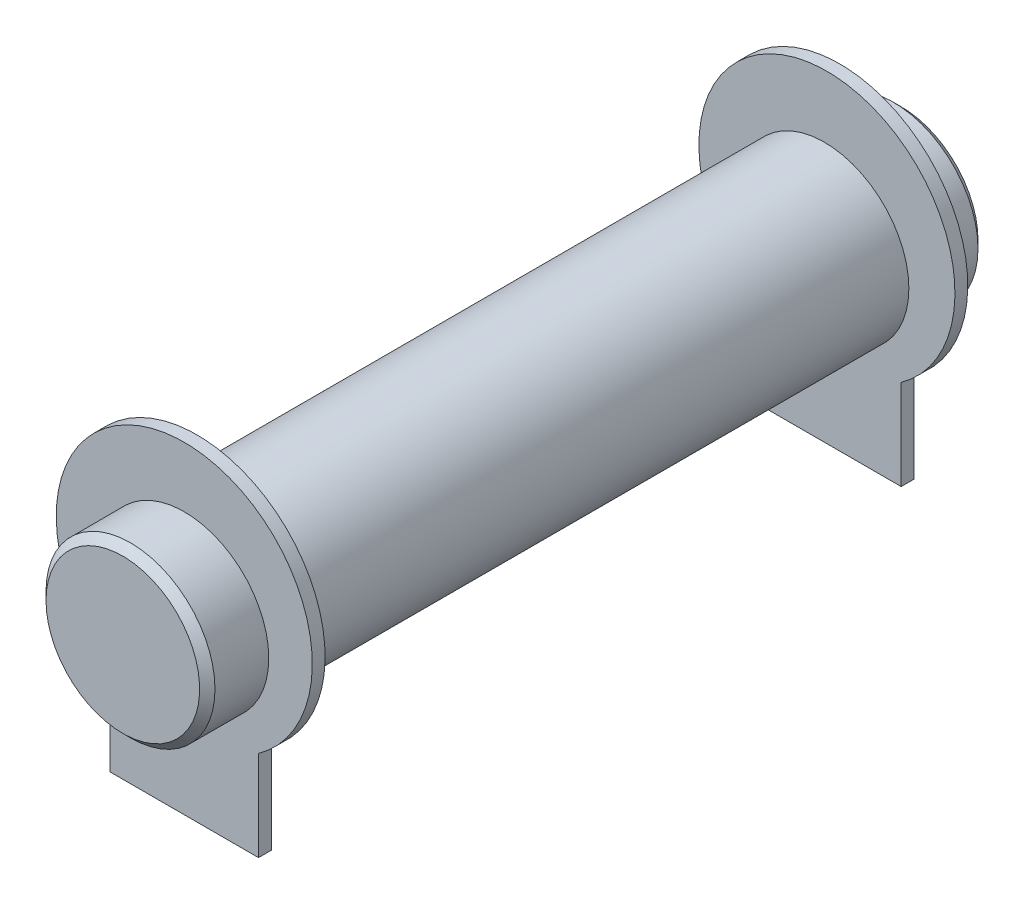
ISO-10303-21;
HEADER;
FILE_DESCRIPTION(('STEP AP214'),'2;1');
FILE_NAME('part.step','',(''),(''),'','','');
FILE_SCHEMA(('AUTOMOTIVE_DESIGN { 1 0 10303 214 1 1 1 1 }'));
ENDSEC;
DATA;
#1=APPLICATION_CONTEXT('core data for automotive mechanical design processes');
#2=APPLICATION_PROTOCOL_DEFINITION('international standard','automotive_design',2000,#1);
#3=PRODUCT_CONTEXT('',#1,'mechanical');
#4=PRODUCT('Part','Part','',(#3));
#5=PRODUCT_RELATED_PRODUCT_CATEGORY('part','',(#4));
#6=PRODUCT_DEFINITION_FORMATION('','',#4);
#7=PRODUCT_DEFINITION_CONTEXT('part definition',#1,'design');
#8=PRODUCT_DEFINITION('design','',#6,#7);
#9=PRODUCT_DEFINITION_SHAPE('','',#8);
#10=(LENGTH_UNIT() NAMED_UNIT(*) SI_UNIT(.MILLI.,.METRE.));
#11=(NAMED_UNIT(*) PLANE_ANGLE_UNIT() SI_UNIT($,.RADIAN.));
#12=(NAMED_UNIT(*) SI_UNIT($,.STERADIAN.) SOLID_ANGLE_UNIT());
#13=UNCERTAINTY_MEASURE_WITH_UNIT(LENGTH_MEASURE(1.E-05),#10,'distance_accuracy_value','');
#14=(GEOMETRIC_REPRESENTATION_CONTEXT(3) GLOBAL_UNCERTAINTY_ASSIGNED_CONTEXT((#13)) GLOBAL_UNIT_ASSIGNED_CONTEXT((#10,
#11,#12)) REPRESENTATION_CONTEXT('',''));
#15=CARTESIAN_POINT('',(0.,0.,0.));
#16=DIRECTION('',(0.,0.,1.));
#17=DIRECTION('',(1.,0.,0.));
#18=AXIS2_PLACEMENT_3D('',#15,#16,#17);
#19=CARTESIAN_POINT('',(1.65,-1.65,6.1));
#20=DIRECTION('',(0.,0.,1.));
#21=DIRECTION('',(0.,1.,0.));
#22=AXIS2_PLACEMENT_3D('',#19,#20,#21);
#23=PLANE('',#22);
#24=CARTESIAN_POINT('',(0.,0.,6.1));
#25=DIRECTION('',(0.,0.,1.));
#26=DIRECTION('',(-1.,0.,0.));
#27=AXIS2_PLACEMENT_3D('',#24,#25,#26);
#28=CIRCLE('',#27,1.65);
#29=CARTESIAN_POINT('',(-1.65,0.,6.1));
#30=VERTEX_POINT('',#29);
#31=EDGE_CURVE('E353',#30,#30,#28,.F.);
#32=ORIENTED_EDGE('',*,*,#31,.F.);
#33=EDGE_LOOP('',(#32));
#34=FACE_BOUND('',#33,.T.);
#35=CARTESIAN_POINT('',(0.,0.,6.1));
#36=DIRECTION('',(0.,0.,-1.));
#37=DIRECTION('',(1.,0.,0.));
#38=AXIS2_PLACEMENT_3D('',#35,#36,#37);
#39=CIRCLE('',#38,1.5);
#40=CARTESIAN_POINT('',(1.5,0.,6.1));
#41=VERTEX_POINT('',#40);
#42=EDGE_CURVE('E348',#41,#41,#39,.T.);
#43=ORIENTED_EDGE('',*,*,#42,.T.);
#44=EDGE_LOOP('',(#43));
#45=FACE_BOUND('',#44,.T.);
#46=ADVANCED_FACE('F16',(#34,#45),#23,.T.);
#47=CARTESIAN_POINT('',(-1.65,-1.65,-6.1));
#48=DIRECTION('',(0.,0.,-1.));
#49=DIRECTION('',(0.,1.,0.));
#50=AXIS2_PLACEMENT_3D('',#47,#48,#49);
#51=PLANE('',#50);
#52=CARTESIAN_POINT('',(0.,0.,-6.1));
#53=DIRECTION('',(0.,0.,-1.));
#54=DIRECTION('',(1.,0.,0.));
#55=AXIS2_PLACEMENT_3D('',#52,#53,#54);
#56=CIRCLE('',#55,1.65);
#57=CARTESIAN_POINT('',(1.65,0.,-6.1));
#58=VERTEX_POINT('',#57);
#59=EDGE_CURVE('E345',#58,#58,#56,.T.);
#60=ORIENTED_EDGE('',*,*,#59,.T.);
#61=EDGE_LOOP('',(#60));
#62=FACE_BOUND('',#61,.T.);
#63=CARTESIAN_POINT('',(0.,0.,-6.1));
#64=DIRECTION('',(0.,0.,1.));
#65=DIRECTION('',(-1.,0.,0.));
#66=AXIS2_PLACEMENT_3D('',#63,#64,#65);
#67=CIRCLE('',#66,1.5);
#68=CARTESIAN_POINT('',(-1.5,0.,-6.1));
#69=VERTEX_POINT('',#68);
#70=EDGE_CURVE('E103',#69,#69,#67,.F.);
#71=ORIENTED_EDGE('',*,*,#70,.F.);
#72=EDGE_LOOP('',(#71));
#73=FACE_BOUND('',#72,.T.);
#74=ADVANCED_FACE('F246',(#62,#73),#51,.T.);
#75=CARTESIAN_POINT('',(1.45,-3.475,6.4));
#76=DIRECTION('',(1.,0.,0.));
#77=DIRECTION('',(0.,0.,-1.));
#78=AXIS2_PLACEMENT_3D('',#75,#76,#77);
#79=PLANE('',#78);
#80=DIRECTION('',(0.,-1.,0.));
#81=VECTOR('',#80,1.);
#82=CARTESIAN_POINT('',(1.45,-1.71154118544161,6.4));
#83=LINE('',#82,#81);
#84=CARTESIAN_POINT('',(1.45,-3.475,6.4));
#85=VERTEX_POINT('',#84);
#86=CARTESIAN_POINT('',(1.45,-1.71154118544161,6.4));
#87=VERTEX_POINT('',#86);
#88=EDGE_CURVE('E84',#85,#87,#83,.F.);
#89=ORIENTED_EDGE('',*,*,#88,.F.);
#90=DIRECTION('',(0.,0.,-1.));
#91=VECTOR('',#90,1.);
#92=CARTESIAN_POINT('',(1.45,-3.475,6.4));
#93=LINE('',#92,#91);
#94=CARTESIAN_POINT('',(1.45,-3.475,6.15));
#95=VERTEX_POINT('',#94);
#96=EDGE_CURVE('E100',#95,#85,#93,.F.);
#97=ORIENTED_EDGE('',*,*,#96,.F.);
#98=DIRECTION('',(0.,1.,0.));
#99=VECTOR('',#98,1.);
#100=CARTESIAN_POINT('',(1.45,-3.475,6.15));
#101=LINE('',#100,#99);
#102=CARTESIAN_POINT('',(1.45,-1.71154118544161,6.15));
#103=VERTEX_POINT('',#102);
#104=EDGE_CURVE('E107',#95,#103,#101,.T.);
#105=ORIENTED_EDGE('',*,*,#104,.T.);
#106=DIRECTION('',(0.,0.,1.));
#107=VECTOR('',#106,1.);
#108=CARTESIAN_POINT('',(1.45,-1.71154118544161,6.15));
#109=LINE('',#108,#107);
#110=EDGE_CURVE('E102',#103,#87,#109,.T.);
#111=ORIENTED_EDGE('',*,*,#110,.T.);
#112=EDGE_LOOP('',(#89,#97,#105,#111));
#113=FACE_BOUND('',#112,.T.);
#114=ADVANCED_FACE('F98',(#113),#79,.T.);
#115=CARTESIAN_POINT('',(0.,0.325000000000014,6.15));
#116=DIRECTION('',(0.,0.,1.));
#117=DIRECTION('',(0.,1.,0.));
#118=AXIS2_PLACEMENT_3D('',#115,#116,#117);
#119=CYLINDRICAL_SURFACE('',#118,2.5);
#120=DIRECTION('',(0.,0.,1.));
#121=VECTOR('',#120,1.);
#122=CARTESIAN_POINT('',(-1.45000000000001,-1.71154118544161,6.15));
#123=LINE('',#122,#121);
#124=CARTESIAN_POINT('',(-1.45000000000001,-1.71154118544161,6.15));
#125=VERTEX_POINT('',#124);
#126=CARTESIAN_POINT('',(-1.45000000000001,-1.71154118544161,6.4));
#127=VERTEX_POINT('',#126);
#128=EDGE_CURVE('E118',#125,#127,#123,.T.);
#129=ORIENTED_EDGE('',*,*,#128,.T.);
#130=CARTESIAN_POINT('',(0.,0.325000000000014,6.4));
#131=DIRECTION('',(0.,0.,-1.));
#132=DIRECTION('',(-0.580000000000003,-0.81461647417665,0.));
#133=AXIS2_PLACEMENT_3D('',#130,#131,#132);
#134=CIRCLE('',#133,2.5);
#135=EDGE_CURVE('E123',#87,#127,#134,.F.);
#136=ORIENTED_EDGE('',*,*,#135,.F.);
#137=ORIENTED_EDGE('',*,*,#110,.F.);
#138=CARTESIAN_POINT('',(0.,0.325000000000014,6.15));
#139=DIRECTION('',(0.,0.,1.));
#140=DIRECTION('',(0.580000000000003,-0.81461647417665,0.));
#141=AXIS2_PLACEMENT_3D('',#138,#139,#140);
#142=CIRCLE('',#141,2.5);
#143=EDGE_CURVE('E127',#103,#125,#142,.T.);
#144=ORIENTED_EDGE('',*,*,#143,.T.);
#145=EDGE_LOOP('',(#129,#136,#137,#144));
#146=FACE_BOUND('',#145,.T.);
#147=ADVANCED_FACE('F259',(#146),#119,.T.);
#148=CARTESIAN_POINT('',(-1.45,-3.475,6.15));
#149=DIRECTION('',(-1.,0.,0.));
#150=DIRECTION('',(0.,0.,1.));
#151=AXIS2_PLACEMENT_3D('',#148,#149,#150);
#152=PLANE('',#151);
#153=DIRECTION('',(0.,1.,0.));
#154=VECTOR('',#153,1.);
#155=CARTESIAN_POINT('',(-1.45,-3.475,6.4));
#156=LINE('',#155,#154);
#157=CARTESIAN_POINT('',(-1.45,-3.475,6.4));
#158=VERTEX_POINT('',#157);
#159=EDGE_CURVE('E87',#127,#158,#156,.F.);
#160=ORIENTED_EDGE('',*,*,#159,.F.);
#161=ORIENTED_EDGE('',*,*,#128,.F.);
#162=DIRECTION('',(0.,-1.,0.));
#163=VECTOR('',#162,1.);
#164=CARTESIAN_POINT('',(-1.45,-1.71154118544161,6.15));
#165=LINE('',#164,#163);
#166=CARTESIAN_POINT('',(-1.45,-3.475,6.15));
#167=VERTEX_POINT('',#166);
#168=EDGE_CURVE('E135',#125,#167,#165,.T.);
#169=ORIENTED_EDGE('',*,*,#168,.T.);
#170=DIRECTION('',(0.,0.,1.));
#171=VECTOR('',#170,1.);
#172=CARTESIAN_POINT('',(-1.45,-3.475,6.15));
#173=LINE('',#172,#171);
#174=EDGE_CURVE('E93',#167,#158,#173,.T.);
#175=ORIENTED_EDGE('',*,*,#174,.T.);
#176=EDGE_LOOP('',(#160,#161,#169,#175));
#177=FACE_BOUND('',#176,.T.);
#178=ADVANCED_FACE('F262',(#177),#152,.T.);
#179=CARTESIAN_POINT('',(-1.45,-3.475,6.4));
#180=DIRECTION('',(0.,-1.,0.));
#181=DIRECTION('',(0.,0.,-1.));
#182=AXIS2_PLACEMENT_3D('',#179,#180,#181);
#183=PLANE('',#182);
#184=DIRECTION('',(-1.,0.,0.));
#185=VECTOR('',#184,1.);
#186=CARTESIAN_POINT('',(1.45,-3.475,6.4));
#187=LINE('',#186,#185);
#188=EDGE_CURVE('E80',#158,#85,#187,.F.);
#189=ORIENTED_EDGE('',*,*,#188,.F.);
#190=ORIENTED_EDGE('',*,*,#174,.F.);
#191=DIRECTION('',(1.,0.,0.));
#192=VECTOR('',#191,1.);
#193=CARTESIAN_POINT('',(-1.45,-3.475,6.15));
#194=LINE('',#193,#192);
#195=EDGE_CURVE('E92',#167,#95,#194,.T.);
#196=ORIENTED_EDGE('',*,*,#195,.T.);
#197=ORIENTED_EDGE('',*,*,#96,.T.);
#198=EDGE_LOOP('',(#189,#190,#196,#197));
#199=FACE_BOUND('',#198,.T.);
#200=ADVANCED_FACE('F106',(#199),#183,.T.);
#201=CARTESIAN_POINT('',(-2.52100179209586,-3.475,6.15));
#202=DIRECTION('',(0.,0.,-1.));
#203=DIRECTION('',(0.,1.,0.));
#204=AXIS2_PLACEMENT_3D('',#201,#202,#203);
#205=PLANE('',#204);
#206=ORIENTED_EDGE('',*,*,#143,.F.);
#207=ORIENTED_EDGE('',*,*,#104,.F.);
#208=ORIENTED_EDGE('',*,*,#195,.F.);
#209=ORIENTED_EDGE('',*,*,#168,.F.);
#210=EDGE_LOOP('',(#206,#207,#208,#209));
#211=FACE_BOUND('',#210,.T.);
#212=CARTESIAN_POINT('',(0.,0.,6.15));
#213=DIRECTION('',(0.,0.,1.));
#214=DIRECTION('',(-1.,0.,0.));
#215=AXIS2_PLACEMENT_3D('',#212,#213,#214);
#216=CIRCLE('',#215,1.5);
#217=CARTESIAN_POINT('',(-1.5,0.,6.15));
#218=VERTEX_POINT('',#217);
#219=EDGE_CURVE('E148',#218,#218,#216,.T.);
#220=ORIENTED_EDGE('',*,*,#219,.T.);
#221=EDGE_LOOP('',(#220));
#222=FACE_BOUND('',#221,.T.);
#223=ADVANCED_FACE('F243',(#211,#222),#205,.T.);
#224=CARTESIAN_POINT('',(-2.52100179209585,-3.475,6.4));
#225=DIRECTION('',(0.,0.,1.));
#226=DIRECTION('',(1.,0.,0.));
#227=AXIS2_PLACEMENT_3D('',#224,#225,#226);
#228=PLANE('',#227);
#229=ORIENTED_EDGE('',*,*,#88,.T.);
#230=ORIENTED_EDGE('',*,*,#135,.T.);
#231=ORIENTED_EDGE('',*,*,#159,.T.);
#232=ORIENTED_EDGE('',*,*,#188,.T.);
#233=EDGE_LOOP('',(#229,#230,#231,#232));
#234=FACE_BOUND('',#233,.T.);
#235=CARTESIAN_POINT('',(0.,0.,6.4));
#236=DIRECTION('',(0.,0.,-1.));
#237=DIRECTION('',(1.,0.,0.));
#238=AXIS2_PLACEMENT_3D('',#235,#236,#237);
#239=CIRCLE('',#238,1.65);
#240=CARTESIAN_POINT('',(1.65,0.,6.4));
#241=VERTEX_POINT('',#240);
#242=EDGE_CURVE('E153',#241,#241,#239,.T.);
#243=ORIENTED_EDGE('',*,*,#242,.T.);
#244=EDGE_LOOP('',(#243));
#245=FACE_BOUND('',#244,.T.);
#246=ADVANCED_FACE('F82',(#234,#245),#228,.T.);
#247=CARTESIAN_POINT('',(1.5,-1.5,7.6));
#248=DIRECTION('',(0.,0.,1.));
#249=DIRECTION('',(0.,1.,0.));
#250=AXIS2_PLACEMENT_3D('',#247,#248,#249);
#251=PLANE('',#250);
#252=CARTESIAN_POINT('',(0.,0.,7.6));
#253=DIRECTION('',(0.,0.,1.));
#254=DIRECTION('',(-1.,0.,0.));
#255=AXIS2_PLACEMENT_3D('',#252,#253,#254);
#256=CIRCLE('',#255,1.5);
#257=CARTESIAN_POINT('',(-1.5,0.,7.6));
#258=VERTEX_POINT('',#257);
#259=EDGE_CURVE('E156',#258,#258,#256,.F.);
#260=ORIENTED_EDGE('',*,*,#259,.F.);
#261=EDGE_LOOP('',(#260));
#262=FACE_BOUND('',#261,.T.);
#263=ADVANCED_FACE('F231',(#262),#251,.T.);
#264=CARTESIAN_POINT('',(1.45,-3.475,-6.4));
#265=DIRECTION('',(1.,0.,0.));
#266=DIRECTION('',(0.,1.,0.));
#267=AXIS2_PLACEMENT_3D('',#264,#265,#266);
#268=PLANE('',#267);
#269=DIRECTION('',(0.,1.,0.));
#270=VECTOR('',#269,1.);
#271=CARTESIAN_POINT('',(1.45,-3.475,-6.4));
#272=LINE('',#271,#270);
#273=CARTESIAN_POINT('',(1.45,-3.475,-6.4));
#274=VERTEX_POINT('',#273);
#275=CARTESIAN_POINT('',(1.45,-1.71154118544161,-6.4));
#276=VERTEX_POINT('',#275);
#277=EDGE_CURVE('E159',#274,#276,#272,.T.);
#278=ORIENTED_EDGE('',*,*,#277,.T.);
#279=DIRECTION('',(0.,0.,1.));
#280=VECTOR('',#279,1.);
#281=CARTESIAN_POINT('',(1.45,-1.71154118544161,-6.4));
#282=LINE('',#281,#280);
#283=CARTESIAN_POINT('',(1.45,-1.71154118544161,-6.15));
#284=VERTEX_POINT('',#283);
#285=EDGE_CURVE('E162',#284,#276,#282,.F.);
#286=ORIENTED_EDGE('',*,*,#285,.F.);
#287=DIRECTION('',(0.,-1.,0.));
#288=VECTOR('',#287,1.);
#289=CARTESIAN_POINT('',(1.45,-1.71154118544161,-6.15));
#290=LINE('',#289,#288);
#291=CARTESIAN_POINT('',(1.45,-3.475,-6.15));
#292=VERTEX_POINT('',#291);
#293=EDGE_CURVE('E167',#292,#284,#290,.F.);
#294=ORIENTED_EDGE('',*,*,#293,.F.);
#295=DIRECTION('',(0.,0.,-1.));
#296=VECTOR('',#295,1.);
#297=CARTESIAN_POINT('',(1.45,-3.475,-6.15));
#298=LINE('',#297,#296);
#299=EDGE_CURVE('E171',#292,#274,#298,.T.);
#300=ORIENTED_EDGE('',*,*,#299,.T.);
#301=EDGE_LOOP('',(#278,#286,#294,#300));
#302=FACE_BOUND('',#301,.T.);
#303=ADVANCED_FACE('F233',(#302),#268,.T.);
#304=CARTESIAN_POINT('',(0.,0.325000000000014,-6.15));
#305=DIRECTION('',(0.,0.,-1.));
#306=DIRECTION('',(0.,1.,0.));
#307=AXIS2_PLACEMENT_3D('',#304,#305,#306);
#308=CYLINDRICAL_SURFACE('',#307,2.5);
#309=ORIENTED_EDGE('',*,*,#285,.T.);
#310=CARTESIAN_POINT('',(0.,0.325000000000014,-6.4));
#311=DIRECTION('',(0.,0.,1.));
#312=DIRECTION('',(0.580000000000003,-0.81461647417665,0.));
#313=AXIS2_PLACEMENT_3D('',#310,#311,#312);
#314=CIRCLE('',#313,2.5);
#315=CARTESIAN_POINT('',(-1.45000000000001,-1.71154118544161,-6.4));
#316=VERTEX_POINT('',#315);
#317=EDGE_CURVE('E176',#276,#316,#314,.T.);
#318=ORIENTED_EDGE('',*,*,#317,.T.);
#319=DIRECTION('',(0.,0.,1.));
#320=VECTOR('',#319,1.);
#321=CARTESIAN_POINT('',(-1.45000000000001,-1.71154118544161,-6.4));
#322=LINE('',#321,#320);
#323=CARTESIAN_POINT('',(-1.45000000000001,-1.71154118544161,-6.15));
#324=VERTEX_POINT('',#323);
#325=EDGE_CURVE('E181',#324,#316,#322,.F.);
#326=ORIENTED_EDGE('',*,*,#325,.F.);
#327=CARTESIAN_POINT('',(0.,0.325000000000014,-6.15));
#328=DIRECTION('',(0.,0.,-1.));
#329=DIRECTION('',(-0.580000000000003,-0.81461647417665,0.));
#330=AXIS2_PLACEMENT_3D('',#327,#328,#329);
#331=CIRCLE('',#330,2.5);
#332=EDGE_CURVE('E186',#284,#324,#331,.F.);
#333=ORIENTED_EDGE('',*,*,#332,.F.);
#334=EDGE_LOOP('',(#309,#318,#326,#333));
#335=FACE_BOUND('',#334,.T.);
#336=ADVANCED_FACE('F240',(#335),#308,.T.);
#337=CARTESIAN_POINT('',(-1.45,-3.475,-6.15));
#338=DIRECTION('',(-1.,0.,0.));
#339=DIRECTION('',(0.,1.,0.));
#340=AXIS2_PLACEMENT_3D('',#337,#338,#339);
#341=PLANE('',#340);
#342=DIRECTION('',(0.,-1.,0.));
#343=VECTOR('',#342,1.);
#344=CARTESIAN_POINT('',(-1.45,-1.71154118544161,-6.4));
#345=LINE('',#344,#343);
#346=CARTESIAN_POINT('',(-1.45,-3.475,-6.4));
#347=VERTEX_POINT('',#346);
#348=EDGE_CURVE('E190',#316,#347,#345,.T.);
#349=ORIENTED_EDGE('',*,*,#348,.T.);
#350=DIRECTION('',(0.,0.,1.));
#351=VECTOR('',#350,1.);
#352=CARTESIAN_POINT('',(-1.45,-3.475,-6.4));
#353=LINE('',#352,#351);
#354=CARTESIAN_POINT('',(-1.45,-3.475,-6.15));
#355=VERTEX_POINT('',#354);
#356=EDGE_CURVE('E194',#355,#347,#353,.F.);
#357=ORIENTED_EDGE('',*,*,#356,.F.);
#358=DIRECTION('',(0.,1.,0.));
#359=VECTOR('',#358,1.);
#360=CARTESIAN_POINT('',(-1.45,-3.475,-6.15));
#361=LINE('',#360,#359);
#362=EDGE_CURVE('E31',#324,#355,#361,.F.);
#363=ORIENTED_EDGE('',*,*,#362,.F.);
#364=ORIENTED_EDGE('',*,*,#325,.T.);
#365=EDGE_LOOP('',(#349,#357,#363,#364));
#366=FACE_BOUND('',#365,.T.);
#367=ADVANCED_FACE('F324',(#366),#341,.T.);
#368=CARTESIAN_POINT('',(-1.45,-3.475,-6.4));
#369=DIRECTION('',(0.,-1.,0.));
#370=DIRECTION('',(1.,0.,0.));
#371=AXIS2_PLACEMENT_3D('',#368,#369,#370);
#372=PLANE('',#371);
#373=DIRECTION('',(1.,0.,0.));
#374=VECTOR('',#373,1.);
#375=CARTESIAN_POINT('',(-1.45,-3.475,-6.4));
#376=LINE('',#375,#374);
#377=EDGE_CURVE('E39',#347,#274,#376,.T.);
#378=ORIENTED_EDGE('',*,*,#377,.T.);
#379=ORIENTED_EDGE('',*,*,#299,.F.);
#380=DIRECTION('',(-1.,0.,0.));
#381=VECTOR('',#380,1.);
#382=CARTESIAN_POINT('',(1.45,-3.475,-6.15));
#383=LINE('',#382,#381);
#384=EDGE_CURVE('E205',#355,#292,#383,.F.);
#385=ORIENTED_EDGE('',*,*,#384,.F.);
#386=ORIENTED_EDGE('',*,*,#356,.T.);
#387=EDGE_LOOP('',(#378,#379,#385,#386));
#388=FACE_BOUND('',#387,.T.);
#389=ADVANCED_FACE('F319',(#388),#372,.T.);
#390=CARTESIAN_POINT('',(-2.52100179209585,-3.475,-6.15));
#391=DIRECTION('',(0.,0.,1.));
#392=DIRECTION('',(1.,0.,0.));
#393=AXIS2_PLACEMENT_3D('',#390,#391,#392);
#394=PLANE('',#393);
#395=ORIENTED_EDGE('',*,*,#293,.T.);
#396=ORIENTED_EDGE('',*,*,#332,.T.);
#397=ORIENTED_EDGE('',*,*,#362,.T.);
#398=ORIENTED_EDGE('',*,*,#384,.T.);
#399=EDGE_LOOP('',(#395,#396,#397,#398));
#400=FACE_BOUND('',#399,.T.);
#401=CARTESIAN_POINT('',(0.,0.,-6.15));
#402=DIRECTION('',(0.,0.,-1.));
#403=DIRECTION('',(0.99999999999999,-1.42053895757501E-07,0.));
#404=AXIS2_PLACEMENT_3D('',#401,#402,#403);
#405=CIRCLE('',#404,1.5);
#406=CARTESIAN_POINT('',(1.49999999999998,-2.13080843636252E-07,-6.15));
#407=VERTEX_POINT('',#406);
#408=EDGE_CURVE('E209',#407,#407,#405,.F.);
#409=ORIENTED_EDGE('',*,*,#408,.F.);
#410=EDGE_LOOP('',(#409));
#411=FACE_BOUND('',#410,.T.);
#412=ADVANCED_FACE('F315',(#400,#411),#394,.T.);
#413=CARTESIAN_POINT('',(-2.52100179209585,-3.475,-6.4));
#414=DIRECTION('',(0.,0.,-1.));
#415=DIRECTION('',(0.,1.,0.));
#416=AXIS2_PLACEMENT_3D('',#413,#414,#415);
#417=PLANE('',#416);
#418=ORIENTED_EDGE('',*,*,#317,.F.);
#419=ORIENTED_EDGE('',*,*,#277,.F.);
#420=ORIENTED_EDGE('',*,*,#377,.F.);
#421=ORIENTED_EDGE('',*,*,#348,.F.);
#422=EDGE_LOOP('',(#418,#419,#420,#421));
#423=FACE_BOUND('',#422,.T.);
#424=CARTESIAN_POINT('',(0.,0.,-6.4));
#425=DIRECTION('',(0.,0.,1.));
#426=DIRECTION('',(-1.,0.,0.));
#427=AXIS2_PLACEMENT_3D('',#424,#425,#426);
#428=CIRCLE('',#427,1.65);
#429=CARTESIAN_POINT('',(-1.65,0.,-6.4));
#430=VERTEX_POINT('',#429);
#431=EDGE_CURVE('E214',#430,#430,#428,.T.);
#432=ORIENTED_EDGE('',*,*,#431,.T.);
#433=EDGE_LOOP('',(#432));
#434=FACE_BOUND('',#433,.T.);
#435=ADVANCED_FACE('F288',(#423,#434),#417,.T.);
#436=CARTESIAN_POINT('',(-1.5,-1.5,-7.6));
#437=DIRECTION('',(0.,0.,-1.));
#438=DIRECTION('',(0.,1.,0.));
#439=AXIS2_PLACEMENT_3D('',#436,#437,#438);
#440=PLANE('',#439);
#441=CARTESIAN_POINT('',(0.,0.,-7.6));
#442=DIRECTION('',(0.,0.,-1.));
#443=DIRECTION('',(1.,0.,0.));
#444=AXIS2_PLACEMENT_3D('',#441,#442,#443);
#445=CIRCLE('',#444,1.5);
#446=CARTESIAN_POINT('',(1.5,0.,-7.6));
#447=VERTEX_POINT('',#446);
#448=EDGE_CURVE('E217',#447,#447,#445,.T.);
#449=ORIENTED_EDGE('',*,*,#448,.T.);
#450=EDGE_LOOP('',(#449));
#451=FACE_BOUND('',#450,.T.);
#452=ADVANCED_FACE('F279',(#451),#440,.T.);
#453=CARTESIAN_POINT('',(0.,0.,-50.));
#454=DIRECTION('',(0.,0.,-1.));
#455=DIRECTION('',(0.99999999999999,1.42053895879963E-07,0.));
#456=AXIS2_PLACEMENT_3D('',#453,#454,#455);
#457=CYLINDRICAL_SURFACE('',#456,1.5);
#458=ORIENTED_EDGE('',*,*,#42,.F.);
#459=EDGE_LOOP('',(#458));
#460=FACE_BOUND('',#459,.T.);
#461=ORIENTED_EDGE('',*,*,#219,.F.);
#462=EDGE_LOOP('',(#461));
#463=FACE_BOUND('',#462,.T.);
#464=ADVANCED_FACE('F276',(#460,#463),#457,.T.);
#465=CARTESIAN_POINT('',(0.,0.,-50.));
#466=DIRECTION('',(0.,0.,-1.));
#467=DIRECTION('',(1.,0.,0.));
#468=AXIS2_PLACEMENT_3D('',#465,#466,#467);
#469=CYLINDRICAL_SURFACE('',#468,1.65);
#470=ORIENTED_EDGE('',*,*,#59,.F.);
#471=EDGE_LOOP('',(#470));
#472=FACE_BOUND('',#471,.T.);
#473=ORIENTED_EDGE('',*,*,#31,.T.);
#474=EDGE_LOOP('',(#473));
#475=FACE_BOUND('',#474,.T.);
#476=ADVANCED_FACE('F278',(#472,#475),#469,.T.);
#477=CARTESIAN_POINT('',(0.,0.,-50.));
#478=DIRECTION('',(0.,0.,-1.));
#479=DIRECTION('',(0.99999999999999,1.42229676159185E-07,0.));
#480=AXIS2_PLACEMENT_3D('',#477,#478,#479);
#481=CYLINDRICAL_SURFACE('',#480,1.5);
#482=ORIENTED_EDGE('',*,*,#408,.T.);
#483=EDGE_LOOP('',(#482));
#484=FACE_BOUND('',#483,.T.);
#485=ORIENTED_EDGE('',*,*,#70,.T.);
#486=EDGE_LOOP('',(#485));
#487=FACE_BOUND('',#486,.T.);
#488=ADVANCED_FACE('F227',(#484,#487),#481,.T.);
#489=CARTESIAN_POINT('',(0.,0.,7.45));
#490=DIRECTION('',(0.,0.,-1.));
#491=DIRECTION('',(1.,1.92327165644965E-10,0.));
#492=AXIS2_PLACEMENT_3D('',#489,#490,#491);
#493=CONICAL_SURFACE('',#492,1.65,0.785398163397434);
#494=CARTESIAN_POINT('',(0.,0.,7.45));
#495=DIRECTION('',(0.,0.,1.));
#496=DIRECTION('',(-1.,0.,0.));
#497=AXIS2_PLACEMENT_3D('',#494,#495,#496);
#498=CIRCLE('',#497,1.65);
#499=CARTESIAN_POINT('',(-1.65,0.,7.45));
#500=VERTEX_POINT('',#499);
#501=EDGE_CURVE('E24',#500,#500,#498,.F.);
#502=ORIENTED_EDGE('',*,*,#501,.F.);
#503=EDGE_LOOP('',(#502));
#504=FACE_BOUND('',#503,.T.);
#505=ORIENTED_EDGE('',*,*,#259,.T.);
#506=EDGE_LOOP('',(#505));
#507=FACE_BOUND('',#506,.T.);
#508=ADVANCED_FACE('F224',(#504,#507),#493,.T.);
#509=CARTESIAN_POINT('',(0.,0.,-50.));
#510=DIRECTION('',(0.,0.,-1.));
#511=DIRECTION('',(1.,7.69308295185819E-10,0.));
#512=AXIS2_PLACEMENT_3D('',#509,#510,#511);
#513=CYLINDRICAL_SURFACE('',#512,1.65);
#514=ORIENTED_EDGE('',*,*,#242,.F.);
#515=EDGE_LOOP('',(#514));
#516=FACE_BOUND('',#515,.T.);
#517=ORIENTED_EDGE('',*,*,#501,.T.);
#518=EDGE_LOOP('',(#517));
#519=FACE_BOUND('',#518,.T.);
#520=ADVANCED_FACE('F222',(#516,#519),#513,.T.);
#521=CARTESIAN_POINT('',(0.,0.,-7.45));
#522=DIRECTION('',(0.,0.,1.));
#523=DIRECTION('',(-1.,0.,0.));
#524=AXIS2_PLACEMENT_3D('',#521,#522,#523);
#525=CONICAL_SURFACE('',#524,1.65,0.785398163397434);
#526=ORIENTED_EDGE('',*,*,#448,.F.);
#527=EDGE_LOOP('',(#526));
#528=FACE_BOUND('',#527,.T.);
#529=CARTESIAN_POINT('',(0.,0.,-7.45));
#530=DIRECTION('',(0.,0.,-1.));
#531=DIRECTION('',(1.,0.,0.));
#532=AXIS2_PLACEMENT_3D('',#529,#530,#531);
#533=CIRCLE('',#532,1.65);
#534=CARTESIAN_POINT('',(1.65,0.,-7.45));
#535=VERTEX_POINT('',#534);
#536=EDGE_CURVE('E10',#535,#535,#533,.T.);
#537=ORIENTED_EDGE('',*,*,#536,.T.);
#538=EDGE_LOOP('',(#537));
#539=FACE_BOUND('',#538,.T.);
#540=ADVANCED_FACE('F298',(#528,#539),#525,.T.);
#541=CARTESIAN_POINT('',(0.,0.,-50.));
#542=DIRECTION('',(0.,0.,-1.));
#543=DIRECTION('',(0.99999999999999,1.42053914087621E-07,0.));
#544=AXIS2_PLACEMENT_3D('',#541,#542,#543);
#545=CYLINDRICAL_SURFACE('',#544,1.65);
#546=ORIENTED_EDGE('',*,*,#431,.F.);
#547=EDGE_LOOP('',(#546));
#548=FACE_BOUND('',#547,.T.);
#549=ORIENTED_EDGE('',*,*,#536,.F.);
#550=EDGE_LOOP('',(#549));
#551=FACE_BOUND('',#550,.T.);
#552=ADVANCED_FACE('F18',(#548,#551),#545,.T.);
#553=CLOSED_SHELL('',(#46,#74,#114,#147,#178,#200,#223,#246,#263,#303,#336,#367,#389,#412,#435,
#452,#464,#476,#488,#508,#520,#540,#552));
#554=MANIFOLD_SOLID_BREP('B1',#553);
#555=ADVANCED_BREP_SHAPE_REPRESENTATION('',(#18,#554),#14);
#556=SHAPE_DEFINITION_REPRESENTATION(#9,#555);
ENDSEC;
END-ISO-10303-21;
